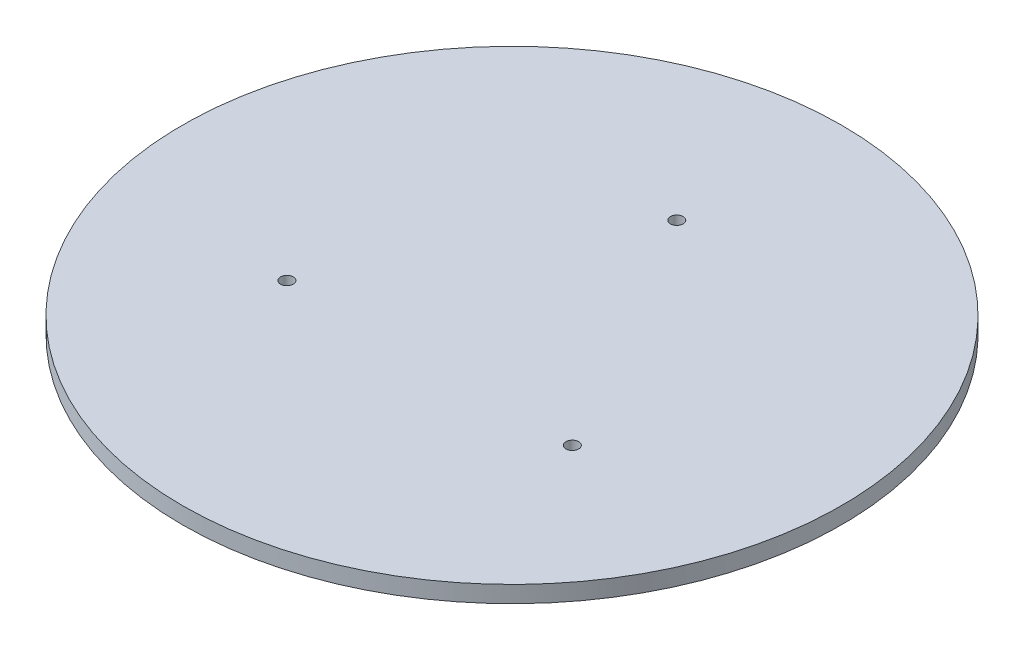
ISO-10303-21;
HEADER;
FILE_DESCRIPTION(('STEP AP214'),'2;1');
FILE_NAME('part.step','',(''),(''),'','','');
FILE_SCHEMA(('AUTOMOTIVE_DESIGN { 1 0 10303 214 1 1 1 1 }'));
ENDSEC;
DATA;
#1=APPLICATION_CONTEXT('core data for automotive mechanical design processes');
#2=APPLICATION_PROTOCOL_DEFINITION('international standard','automotive_design',2000,#1);
#3=PRODUCT_CONTEXT('',#1,'mechanical');
#4=PRODUCT('Part','Part','',(#3));
#5=PRODUCT_RELATED_PRODUCT_CATEGORY('part','',(#4));
#6=PRODUCT_DEFINITION_FORMATION('','',#4);
#7=PRODUCT_DEFINITION_CONTEXT('part definition',#1,'design');
#8=PRODUCT_DEFINITION('design','',#6,#7);
#9=PRODUCT_DEFINITION_SHAPE('','',#8);
#10=(LENGTH_UNIT() NAMED_UNIT(*) SI_UNIT(.MILLI.,.METRE.));
#11=(NAMED_UNIT(*) PLANE_ANGLE_UNIT() SI_UNIT($,.RADIAN.));
#12=(NAMED_UNIT(*) SI_UNIT($,.STERADIAN.) SOLID_ANGLE_UNIT());
#13=UNCERTAINTY_MEASURE_WITH_UNIT(LENGTH_MEASURE(1.E-05),#10,'distance_accuracy_value','');
#14=(GEOMETRIC_REPRESENTATION_CONTEXT(3) GLOBAL_UNCERTAINTY_ASSIGNED_CONTEXT((#13)) GLOBAL_UNIT_ASSIGNED_CONTEXT((#10,
#11,#12)) REPRESENTATION_CONTEXT('',''));
#15=CARTESIAN_POINT('',(0.,0.,0.));
#16=DIRECTION('',(0.,0.,1.));
#17=DIRECTION('',(1.,0.,0.));
#18=AXIS2_PLACEMENT_3D('',#15,#16,#17);
#19=CARTESIAN_POINT('',(0.,6.35,0.));
#20=DIRECTION('',(0.,1.,0.));
#21=DIRECTION('',(0.,0.,1.));
#22=AXIS2_PLACEMENT_3D('',#19,#20,#21);
#23=PLANE('',#22);
#24=CARTESIAN_POINT('',(54.2914573227729,6.35,31.3451875));
#25=DIRECTION('',(0.,1.,0.));
#26=DIRECTION('',(0.,0.,1.));
#27=AXIS2_PLACEMENT_3D('',#24,#25,#26);
#28=CIRCLE('',#27,2.4257);
#29=CARTESIAN_POINT('',(54.2914573227729,6.35,33.7708875));
#30=VERTEX_POINT('',#29);
#31=EDGE_CURVE('E47',#30,#30,#28,.T.);
#32=ORIENTED_EDGE('',*,*,#31,.F.);
#33=EDGE_LOOP('',(#32));
#34=FACE_BOUND('',#33,.T.);
#35=CARTESIAN_POINT('',(0.,6.35,0.));
#36=DIRECTION('',(0.,1.,0.));
#37=DIRECTION('',(0.,0.,1.));
#38=AXIS2_PLACEMENT_3D('',#35,#36,#37);
#39=CIRCLE('',#38,125.38075);
#40=CARTESIAN_POINT('',(0.,6.35,125.38075));
#41=VERTEX_POINT('',#40);
#42=EDGE_CURVE('E10',#41,#41,#39,.T.);
#43=ORIENTED_EDGE('',*,*,#42,.T.);
#44=EDGE_LOOP('',(#43));
#45=FACE_BOUND('',#44,.T.);
#46=CARTESIAN_POINT('',(0.,6.35,-62.690375));
#47=DIRECTION('',(0.,1.,0.));
#48=DIRECTION('',(0.,0.,1.));
#49=AXIS2_PLACEMENT_3D('',#46,#47,#48);
#50=CIRCLE('',#49,2.4257);
#51=CARTESIAN_POINT('',(0.,6.35,-60.264675));
#52=VERTEX_POINT('',#51);
#53=EDGE_CURVE('E42',#52,#52,#50,.T.);
#54=ORIENTED_EDGE('',*,*,#53,.F.);
#55=EDGE_LOOP('',(#54));
#56=FACE_BOUND('',#55,.T.);
#57=CARTESIAN_POINT('',(-54.2914573227729,6.35,31.3451875));
#58=DIRECTION('',(0.,1.,0.));
#59=DIRECTION('',(0.,0.,1.));
#60=AXIS2_PLACEMENT_3D('',#57,#58,#59);
#61=CIRCLE('',#60,2.4257);
#62=CARTESIAN_POINT('',(-54.2914573227729,6.35,33.7708875));
#63=VERTEX_POINT('',#62);
#64=EDGE_CURVE('E53',#63,#63,#61,.T.);
#65=ORIENTED_EDGE('',*,*,#64,.F.);
#66=EDGE_LOOP('',(#65));
#67=FACE_BOUND('',#66,.T.);
#68=ADVANCED_FACE('F31',(#34,#45,#56,#67),#23,.T.);
#69=CARTESIAN_POINT('',(0.,0.,0.));
#70=DIRECTION('',(0.,1.,0.));
#71=DIRECTION('',(0.,0.,1.));
#72=AXIS2_PLACEMENT_3D('',#69,#70,#71);
#73=PLANE('',#72);
#74=CARTESIAN_POINT('',(54.2914573227729,0.,31.3451875));
#75=DIRECTION('',(0.,1.,0.));
#76=DIRECTION('',(0.,0.,1.));
#77=AXIS2_PLACEMENT_3D('',#74,#75,#76);
#78=CIRCLE('',#77,2.4257);
#79=CARTESIAN_POINT('',(54.2914573227729,0.,33.7708875));
#80=VERTEX_POINT('',#79);
#81=EDGE_CURVE('E50',#80,#80,#78,.T.);
#82=ORIENTED_EDGE('',*,*,#81,.T.);
#83=EDGE_LOOP('',(#82));
#84=FACE_BOUND('',#83,.T.);
#85=CARTESIAN_POINT('',(0.,0.,0.));
#86=DIRECTION('',(0.,1.,0.));
#87=DIRECTION('',(0.,0.,1.));
#88=AXIS2_PLACEMENT_3D('',#85,#86,#87);
#89=CIRCLE('',#88,125.38075);
#90=CARTESIAN_POINT('',(0.,0.,125.38075));
#91=VERTEX_POINT('',#90);
#92=EDGE_CURVE('E35',#91,#91,#89,.T.);
#93=ORIENTED_EDGE('',*,*,#92,.F.);
#94=EDGE_LOOP('',(#93));
#95=FACE_BOUND('',#94,.T.);
#96=CARTESIAN_POINT('',(0.,0.,-62.690375));
#97=DIRECTION('',(0.,1.,0.));
#98=DIRECTION('',(0.,0.,1.));
#99=AXIS2_PLACEMENT_3D('',#96,#97,#98);
#100=CIRCLE('',#99,2.4257);
#101=CARTESIAN_POINT('',(0.,0.,-60.264675));
#102=VERTEX_POINT('',#101);
#103=EDGE_CURVE('E44',#102,#102,#100,.T.);
#104=ORIENTED_EDGE('',*,*,#103,.T.);
#105=EDGE_LOOP('',(#104));
#106=FACE_BOUND('',#105,.T.);
#107=CARTESIAN_POINT('',(-54.2914573227729,0.,31.3451875));
#108=DIRECTION('',(0.,1.,0.));
#109=DIRECTION('',(0.,0.,1.));
#110=AXIS2_PLACEMENT_3D('',#107,#108,#109);
#111=CIRCLE('',#110,2.4257);
#112=CARTESIAN_POINT('',(-54.2914573227729,0.,33.7708875));
#113=VERTEX_POINT('',#112);
#114=EDGE_CURVE('E56',#113,#113,#111,.T.);
#115=ORIENTED_EDGE('',*,*,#114,.T.);
#116=EDGE_LOOP('',(#115));
#117=FACE_BOUND('',#116,.T.);
#118=ADVANCED_FACE('F66',(#84,#95,#106,#117),#73,.F.);
#119=CARTESIAN_POINT('',(0.,6.35,0.));
#120=DIRECTION('',(0.,-1.,0.));
#121=DIRECTION('',(0.,0.,-1.));
#122=AXIS2_PLACEMENT_3D('',#119,#120,#121);
#123=CYLINDRICAL_SURFACE('',#122,125.38075);
#124=ORIENTED_EDGE('',*,*,#42,.F.);
#125=EDGE_LOOP('',(#124));
#126=FACE_BOUND('',#125,.T.);
#127=ORIENTED_EDGE('',*,*,#92,.T.);
#128=EDGE_LOOP('',(#127));
#129=FACE_BOUND('',#128,.T.);
#130=ADVANCED_FACE('F33',(#126,#129),#123,.T.);
#131=CARTESIAN_POINT('',(0.,6.35,-62.690375));
#132=DIRECTION('',(0.,-1.,0.));
#133=DIRECTION('',(0.,0.,-1.));
#134=AXIS2_PLACEMENT_3D('',#131,#132,#133);
#135=CYLINDRICAL_SURFACE('',#134,2.4257);
#136=ORIENTED_EDGE('',*,*,#53,.T.);
#137=EDGE_LOOP('',(#136));
#138=FACE_BOUND('',#137,.T.);
#139=ORIENTED_EDGE('',*,*,#103,.F.);
#140=EDGE_LOOP('',(#139));
#141=FACE_BOUND('',#140,.T.);
#142=ADVANCED_FACE('F75',(#138,#141),#135,.F.);
#143=CARTESIAN_POINT('',(54.2914573227729,6.35,31.3451875));
#144=DIRECTION('',(0.,-1.,0.));
#145=DIRECTION('',(0.,0.,-1.));
#146=AXIS2_PLACEMENT_3D('',#143,#144,#145);
#147=CYLINDRICAL_SURFACE('',#146,2.4257);
#148=ORIENTED_EDGE('',*,*,#31,.T.);
#149=EDGE_LOOP('',(#148));
#150=FACE_BOUND('',#149,.T.);
#151=ORIENTED_EDGE('',*,*,#81,.F.);
#152=EDGE_LOOP('',(#151));
#153=FACE_BOUND('',#152,.T.);
#154=ADVANCED_FACE('F78',(#150,#153),#147,.F.);
#155=CARTESIAN_POINT('',(-54.2914573227729,6.35,31.3451875));
#156=DIRECTION('',(0.,-1.,0.));
#157=DIRECTION('',(0.,0.,-1.));
#158=AXIS2_PLACEMENT_3D('',#155,#156,#157);
#159=CYLINDRICAL_SURFACE('',#158,2.4257);
#160=ORIENTED_EDGE('',*,*,#64,.T.);
#161=EDGE_LOOP('',(#160));
#162=FACE_BOUND('',#161,.T.);
#163=ORIENTED_EDGE('',*,*,#114,.F.);
#164=EDGE_LOOP('',(#163));
#165=FACE_BOUND('',#164,.T.);
#166=ADVANCED_FACE('F62',(#162,#165),#159,.F.);
#167=CLOSED_SHELL('',(#68,#118,#130,#142,#154,#166));
#168=MANIFOLD_SOLID_BREP('B2',#167);
#169=ADVANCED_BREP_SHAPE_REPRESENTATION('',(#18,#168),#14);
#170=SHAPE_DEFINITION_REPRESENTATION(#9,#169);
ENDSEC;
END-ISO-10303-21;
